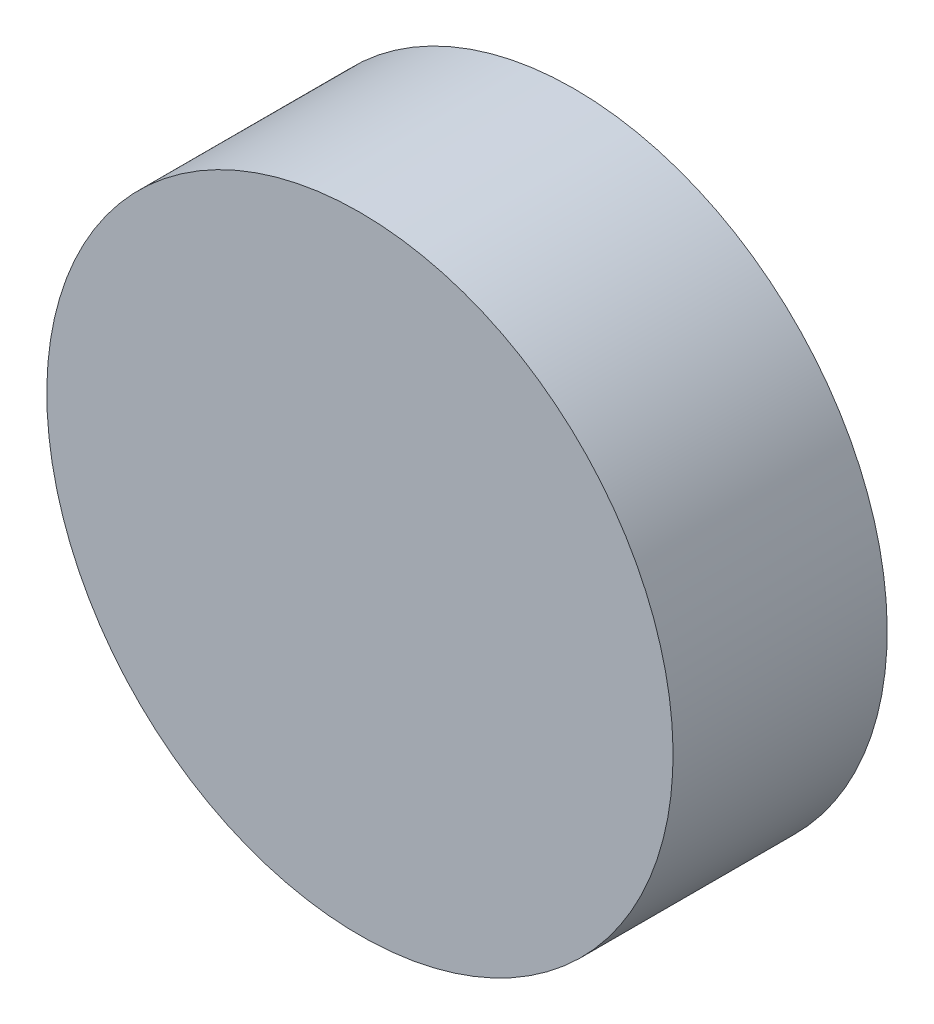
ISO-10303-21;
HEADER;
FILE_DESCRIPTION(('STEP AP214'),'2;1');
FILE_NAME('part.step','',(''),(''),'','','');
FILE_SCHEMA(('AUTOMOTIVE_DESIGN { 1 0 10303 214 1 1 1 1 }'));
ENDSEC;
DATA;
#1=APPLICATION_CONTEXT('core data for automotive mechanical design processes');
#2=APPLICATION_PROTOCOL_DEFINITION('international standard','automotive_design',2000,#1);
#3=PRODUCT_CONTEXT('',#1,'mechanical');
#4=PRODUCT('Part','Part','',(#3));
#5=PRODUCT_RELATED_PRODUCT_CATEGORY('part','',(#4));
#6=PRODUCT_DEFINITION_FORMATION('','',#4);
#7=PRODUCT_DEFINITION_CONTEXT('part definition',#1,'design');
#8=PRODUCT_DEFINITION('design','',#6,#7);
#9=PRODUCT_DEFINITION_SHAPE('','',#8);
#10=(LENGTH_UNIT() NAMED_UNIT(*) SI_UNIT(.MILLI.,.METRE.));
#11=(NAMED_UNIT(*) PLANE_ANGLE_UNIT() SI_UNIT($,.RADIAN.));
#12=(NAMED_UNIT(*) SI_UNIT($,.STERADIAN.) SOLID_ANGLE_UNIT());
#13=UNCERTAINTY_MEASURE_WITH_UNIT(LENGTH_MEASURE(1.E-05),#10,'distance_accuracy_value','');
#14=(GEOMETRIC_REPRESENTATION_CONTEXT(3) GLOBAL_UNCERTAINTY_ASSIGNED_CONTEXT((#13)) GLOBAL_UNIT_ASSIGNED_CONTEXT((#10,
#11,#12)) REPRESENTATION_CONTEXT('',''));
#15=CARTESIAN_POINT('',(0.,0.,0.));
#16=DIRECTION('',(0.,0.,1.));
#17=DIRECTION('',(1.,0.,0.));
#18=AXIS2_PLACEMENT_3D('',#15,#16,#17);
#19=CARTESIAN_POINT('',(94.619318554078,39.791500026231,-3.358521751819));
#20=DIRECTION('',(0.,8.74227765734797E-08,-0.999999999999996));
#21=DIRECTION('',(0.,0.999999999999996,8.74227765734797E-08));
#22=AXIS2_PLACEMENT_3D('',#19,#20,#21);
#23=PLANE('',#22);
#24=CARTESIAN_POINT('',(94.619318554078,39.7915000262313,-3.3585217518194));
#25=DIRECTION('',(0.,8.74227765734797E-08,-0.999999999999996));
#26=DIRECTION('',(0.,0.999999999999996,8.74227765734797E-08));
#27=AXIS2_PLACEMENT_3D('',#24,#25,#26);
#28=CIRCLE('',#27,0.146227360805);
#29=CARTESIAN_POINT('',(94.619318554078,39.9377273870363,-3.3585217390358));
#30=VERTEX_POINT('',#29);
#31=EDGE_CURVE('E18',#30,#30,#28,.F.);
#32=ORIENTED_EDGE('',*,*,#31,.F.);
#33=EDGE_LOOP('',(#32));
#34=FACE_BOUND('',#33,.T.);
#35=ADVANCED_FACE('F15',(#34),#23,.T.);
#36=CARTESIAN_POINT('',(94.619318554078,39.791500017489,-3.258521751819));
#37=DIRECTION('',(0.,8.74227765734797E-08,-0.999999999999996));
#38=DIRECTION('',(0.,0.999999999999996,8.74227765734797E-08));
#39=AXIS2_PLACEMENT_3D('',#36,#37,#38);
#40=PLANE('',#39);
#41=CARTESIAN_POINT('',(94.619318554078,39.791500017489,-3.2585217518194));
#42=DIRECTION('',(0.,8.74227765734797E-08,-0.999999999999996));
#43=DIRECTION('',(0.,0.999999999999996,8.74227765734797E-08));
#44=AXIS2_PLACEMENT_3D('',#41,#42,#43);
#45=CIRCLE('',#44,0.146227360805);
#46=CARTESIAN_POINT('',(94.619318554078,39.937727378294,-3.2585217390358));
#47=VERTEX_POINT('',#46);
#48=EDGE_CURVE('E10',#47,#47,#45,.T.);
#49=ORIENTED_EDGE('',*,*,#48,.F.);
#50=EDGE_LOOP('',(#49));
#51=FACE_BOUND('',#50,.T.);
#52=ADVANCED_FACE('F30',(#51),#40,.F.);
#53=CARTESIAN_POINT('',(94.619318554078,39.791500017489,-3.258521751819));
#54=DIRECTION('',(0.,8.74227765734797E-08,-0.999999999999996));
#55=DIRECTION('',(0.,0.999999999999996,8.74227765734797E-08));
#56=AXIS2_PLACEMENT_3D('',#53,#54,#55);
#57=CYLINDRICAL_SURFACE('',#56,0.146227360805);
#58=ORIENTED_EDGE('',*,*,#48,.T.);
#59=EDGE_LOOP('',(#58));
#60=FACE_BOUND('',#59,.T.);
#61=ORIENTED_EDGE('',*,*,#31,.T.);
#62=EDGE_LOOP('',(#61));
#63=FACE_BOUND('',#62,.T.);
#64=ADVANCED_FACE('F27',(#60,#63),#57,.T.);
#65=CLOSED_SHELL('',(#35,#52,#64));
#66=MANIFOLD_SOLID_BREP('B1',#65);
#67=ADVANCED_BREP_SHAPE_REPRESENTATION('',(#18,#66),#14);
#68=SHAPE_DEFINITION_REPRESENTATION(#9,#67);
ENDSEC;
END-ISO-10303-21;
